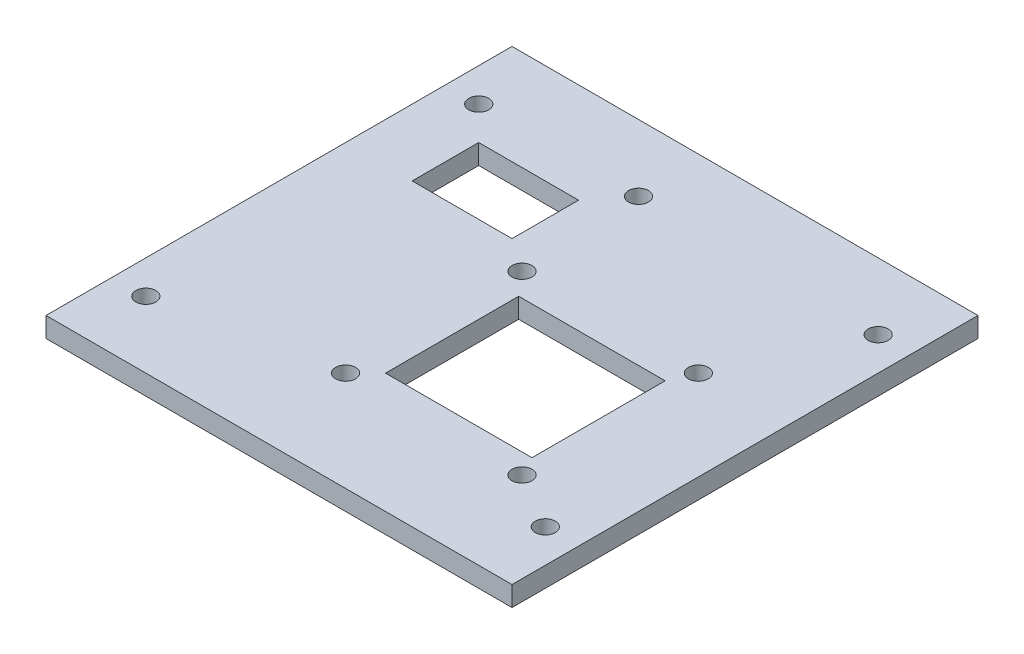
ISO-10303-21;
HEADER;
FILE_DESCRIPTION(('STEP AP214'),'2;1');
FILE_NAME('part.step','',(''),(''),'','','');
FILE_SCHEMA(('AUTOMOTIVE_DESIGN { 1 0 10303 214 1 1 1 1 }'));
ENDSEC;
DATA;
#1=APPLICATION_CONTEXT('core data for automotive mechanical design processes');
#2=APPLICATION_PROTOCOL_DEFINITION('international standard','automotive_design',2000,#1);
#3=PRODUCT_CONTEXT('',#1,'mechanical');
#4=PRODUCT('Part','Part','',(#3));
#5=PRODUCT_RELATED_PRODUCT_CATEGORY('part','',(#4));
#6=PRODUCT_DEFINITION_FORMATION('','',#4);
#7=PRODUCT_DEFINITION_CONTEXT('part definition',#1,'design');
#8=PRODUCT_DEFINITION('design','',#6,#7);
#9=PRODUCT_DEFINITION_SHAPE('','',#8);
#10=(LENGTH_UNIT() NAMED_UNIT(*) SI_UNIT(.MILLI.,.METRE.));
#11=(NAMED_UNIT(*) PLANE_ANGLE_UNIT() SI_UNIT($,.RADIAN.));
#12=(NAMED_UNIT(*) SI_UNIT($,.STERADIAN.) SOLID_ANGLE_UNIT());
#13=UNCERTAINTY_MEASURE_WITH_UNIT(LENGTH_MEASURE(1.E-05),#10,'distance_accuracy_value','');
#14=(GEOMETRIC_REPRESENTATION_CONTEXT(3) GLOBAL_UNCERTAINTY_ASSIGNED_CONTEXT((#13)) GLOBAL_UNIT_ASSIGNED_CONTEXT((#10,
#11,#12)) REPRESENTATION_CONTEXT('',''));
#15=CARTESIAN_POINT('',(0.,0.,0.));
#16=DIRECTION('',(0.,0.,1.));
#17=DIRECTION('',(1.,0.,0.));
#18=AXIS2_PLACEMENT_3D('',#15,#16,#17);
#19=CARTESIAN_POINT('',(-35.,3.,35.));
#20=DIRECTION('',(1.,0.,0.));
#21=DIRECTION('',(0.,0.,-1.));
#22=AXIS2_PLACEMENT_3D('',#19,#20,#21);
#23=PLANE('',#22);
#24=DIRECTION('',(0.,0.,1.));
#25=VECTOR('',#24,1.);
#26=CARTESIAN_POINT('',(-35.,0.,35.));
#27=LINE('',#26,#25);
#28=CARTESIAN_POINT('',(-35.,0.,-35.));
#29=VERTEX_POINT('',#28);
#30=CARTESIAN_POINT('',(-35.,0.,35.));
#31=VERTEX_POINT('',#30);
#32=EDGE_CURVE('E278',#29,#31,#27,.T.);
#33=ORIENTED_EDGE('',*,*,#32,.T.);
#34=DIRECTION('',(0.,-1.,0.));
#35=VECTOR('',#34,1.);
#36=CARTESIAN_POINT('',(-35.,3.,35.));
#37=LINE('',#36,#35);
#38=CARTESIAN_POINT('',(-35.,3.,35.));
#39=VERTEX_POINT('',#38);
#40=EDGE_CURVE('E11',#39,#31,#37,.T.);
#41=ORIENTED_EDGE('',*,*,#40,.F.);
#42=DIRECTION('',(0.,0.,1.));
#43=VECTOR('',#42,1.);
#44=CARTESIAN_POINT('',(-35.,3.,35.));
#45=LINE('',#44,#43);
#46=CARTESIAN_POINT('',(-35.,3.,-35.));
#47=VERTEX_POINT('',#46);
#48=EDGE_CURVE('E282',#47,#39,#45,.T.);
#49=ORIENTED_EDGE('',*,*,#48,.F.);
#50=DIRECTION('',(0.,-1.,0.));
#51=VECTOR('',#50,1.);
#52=CARTESIAN_POINT('',(-35.,3.,-35.));
#53=LINE('',#52,#51);
#54=EDGE_CURVE('E296',#47,#29,#53,.T.);
#55=ORIENTED_EDGE('',*,*,#54,.T.);
#56=EDGE_LOOP('',(#33,#41,#49,#55));
#57=FACE_BOUND('',#56,.T.);
#58=ADVANCED_FACE('F39',(#57),#23,.F.);
#59=CARTESIAN_POINT('',(35.,3.,35.));
#60=DIRECTION('',(0.,0.,-1.));
#61=DIRECTION('',(-1.,0.,0.));
#62=AXIS2_PLACEMENT_3D('',#59,#60,#61);
#63=PLANE('',#62);
#64=DIRECTION('',(1.,0.,0.));
#65=VECTOR('',#64,1.);
#66=CARTESIAN_POINT('',(35.,0.,35.));
#67=LINE('',#66,#65);
#68=CARTESIAN_POINT('',(35.,0.,35.));
#69=VERTEX_POINT('',#68);
#70=EDGE_CURVE('E300',#31,#69,#67,.T.);
#71=ORIENTED_EDGE('',*,*,#70,.T.);
#72=DIRECTION('',(0.,-1.,0.));
#73=VECTOR('',#72,1.);
#74=CARTESIAN_POINT('',(35.,3.,35.));
#75=LINE('',#74,#73);
#76=CARTESIAN_POINT('',(35.,3.,35.));
#77=VERTEX_POINT('',#76);
#78=EDGE_CURVE('E47',#77,#69,#75,.T.);
#79=ORIENTED_EDGE('',*,*,#78,.F.);
#80=DIRECTION('',(1.,0.,0.));
#81=VECTOR('',#80,1.);
#82=CARTESIAN_POINT('',(35.,3.,35.));
#83=LINE('',#82,#81);
#84=EDGE_CURVE('E286',#39,#77,#83,.T.);
#85=ORIENTED_EDGE('',*,*,#84,.F.);
#86=ORIENTED_EDGE('',*,*,#40,.T.);
#87=EDGE_LOOP('',(#71,#79,#85,#86));
#88=FACE_BOUND('',#87,.T.);
#89=ADVANCED_FACE('F335',(#88),#63,.F.);
#90=CARTESIAN_POINT('',(35.,3.,35.));
#91=DIRECTION('',(-1.,0.,0.));
#92=DIRECTION('',(0.,0.,1.));
#93=AXIS2_PLACEMENT_3D('',#90,#91,#92);
#94=PLANE('',#93);
#95=DIRECTION('',(0.,0.,-1.));
#96=VECTOR('',#95,1.);
#97=CARTESIAN_POINT('',(35.,0.,35.));
#98=LINE('',#97,#96);
#99=CARTESIAN_POINT('',(35.,0.,-35.));
#100=VERTEX_POINT('',#99);
#101=EDGE_CURVE('E303',#69,#100,#98,.T.);
#102=ORIENTED_EDGE('',*,*,#101,.T.);
#103=DIRECTION('',(0.,-1.,0.));
#104=VECTOR('',#103,1.);
#105=CARTESIAN_POINT('',(35.,3.,-35.));
#106=LINE('',#105,#104);
#107=CARTESIAN_POINT('',(35.,3.,-35.));
#108=VERTEX_POINT('',#107);
#109=EDGE_CURVE('E311',#108,#100,#106,.T.);
#110=ORIENTED_EDGE('',*,*,#109,.F.);
#111=DIRECTION('',(0.,0.,-1.));
#112=VECTOR('',#111,1.);
#113=CARTESIAN_POINT('',(35.,3.,35.));
#114=LINE('',#113,#112);
#115=EDGE_CURVE('E290',#77,#108,#114,.T.);
#116=ORIENTED_EDGE('',*,*,#115,.F.);
#117=ORIENTED_EDGE('',*,*,#78,.T.);
#118=EDGE_LOOP('',(#102,#110,#116,#117));
#119=FACE_BOUND('',#118,.T.);
#120=ADVANCED_FACE('F320',(#119),#94,.F.);
#121=CARTESIAN_POINT('',(35.,3.,-35.));
#122=DIRECTION('',(0.,0.,1.));
#123=DIRECTION('',(1.,0.,0.));
#124=AXIS2_PLACEMENT_3D('',#121,#122,#123);
#125=PLANE('',#124);
#126=DIRECTION('',(-1.,0.,0.));
#127=VECTOR('',#126,1.);
#128=CARTESIAN_POINT('',(35.,0.,-35.));
#129=LINE('',#128,#127);
#130=EDGE_CURVE('E287',#100,#29,#129,.T.);
#131=ORIENTED_EDGE('',*,*,#130,.T.);
#132=ORIENTED_EDGE('',*,*,#54,.F.);
#133=DIRECTION('',(-1.,0.,0.));
#134=VECTOR('',#133,1.);
#135=CARTESIAN_POINT('',(35.,3.,-35.));
#136=LINE('',#135,#134);
#137=EDGE_CURVE('E293',#108,#47,#136,.T.);
#138=ORIENTED_EDGE('',*,*,#137,.F.);
#139=ORIENTED_EDGE('',*,*,#109,.T.);
#140=EDGE_LOOP('',(#131,#132,#138,#139));
#141=FACE_BOUND('',#140,.T.);
#142=ADVANCED_FACE('F328',(#141),#125,.F.);
#143=CARTESIAN_POINT('',(0.,3.,0.));
#144=DIRECTION('',(0.,1.,0.));
#145=DIRECTION('',(0.,0.,1.));
#146=AXIS2_PLACEMENT_3D('',#143,#144,#145);
#147=PLANE('',#146);
#148=DIRECTION('',(0.,0.,-1.));
#149=VECTOR('',#148,1.);
#150=CARTESIAN_POINT('',(-10.,3.,-20.));
#151=LINE('',#150,#149);
#152=CARTESIAN_POINT('',(-10.,3.,-10.));
#153=VERTEX_POINT('',#152);
#154=CARTESIAN_POINT('',(-10.,3.,-20.));
#155=VERTEX_POINT('',#154);
#156=EDGE_CURVE('E54',#153,#155,#151,.T.);
#157=ORIENTED_EDGE('',*,*,#156,.F.);
#158=DIRECTION('',(1.,0.,0.));
#159=VECTOR('',#158,1.);
#160=CARTESIAN_POINT('',(-25.,3.,-10.));
#161=LINE('',#160,#159);
#162=CARTESIAN_POINT('',(-25.,3.,-10.));
#163=VERTEX_POINT('',#162);
#164=EDGE_CURVE('E189',#163,#153,#161,.T.);
#165=ORIENTED_EDGE('',*,*,#164,.F.);
#166=DIRECTION('',(0.,0.,1.));
#167=VECTOR('',#166,1.);
#168=CARTESIAN_POINT('',(-25.,3.,-20.));
#169=LINE('',#168,#167);
#170=CARTESIAN_POINT('',(-25.,3.,-20.));
#171=VERTEX_POINT('',#170);
#172=EDGE_CURVE('E209',#171,#163,#169,.T.);
#173=ORIENTED_EDGE('',*,*,#172,.F.);
#174=DIRECTION('',(-1.,0.,0.));
#175=VECTOR('',#174,1.);
#176=CARTESIAN_POINT('',(-25.,3.,-20.));
#177=LINE('',#176,#175);
#178=EDGE_CURVE('E204',#155,#171,#177,.T.);
#179=ORIENTED_EDGE('',*,*,#178,.F.);
#180=EDGE_LOOP('',(#157,#165,#173,#179));
#181=FACE_BOUND('',#180,.T.);
#182=DIRECTION('',(0.,0.,1.));
#183=VECTOR('',#182,1.);
#184=CARTESIAN_POINT('',(-1.99999999999999,3.,17.));
#185=LINE('',#184,#183);
#186=CARTESIAN_POINT('',(-1.99999999999999,3.,-2.99999999999999));
#187=VERTEX_POINT('',#186);
#188=CARTESIAN_POINT('',(-1.99999999999999,3.,17.));
#189=VERTEX_POINT('',#188);
#190=EDGE_CURVE('E62',#187,#189,#185,.T.);
#191=ORIENTED_EDGE('',*,*,#190,.F.);
#192=DIRECTION('',(-1.,0.,0.));
#193=VECTOR('',#192,1.);
#194=CARTESIAN_POINT('',(20.,3.,-3.));
#195=LINE('',#194,#193);
#196=CARTESIAN_POINT('',(20.,3.,-3.));
#197=VERTEX_POINT('',#196);
#198=EDGE_CURVE('E152',#197,#187,#195,.T.);
#199=ORIENTED_EDGE('',*,*,#198,.F.);
#200=DIRECTION('',(0.,0.,-1.));
#201=VECTOR('',#200,1.);
#202=CARTESIAN_POINT('',(20.,3.,17.));
#203=LINE('',#202,#201);
#204=CARTESIAN_POINT('',(20.,3.,17.));
#205=VERTEX_POINT('',#204);
#206=EDGE_CURVE('E156',#205,#197,#203,.T.);
#207=ORIENTED_EDGE('',*,*,#206,.F.);
#208=DIRECTION('',(1.,0.,0.));
#209=VECTOR('',#208,1.);
#210=CARTESIAN_POINT('',(20.,3.,17.));
#211=LINE('',#210,#209);
#212=EDGE_CURVE('E168',#189,#205,#211,.T.);
#213=ORIENTED_EDGE('',*,*,#212,.F.);
#214=EDGE_LOOP('',(#191,#199,#207,#213));
#215=FACE_BOUND('',#214,.T.);
#216=CARTESIAN_POINT('',(-5.,3.,20.));
#217=DIRECTION('',(0.,1.,0.));
#218=DIRECTION('',(0.,0.,1.));
#219=AXIS2_PLACEMENT_3D('',#216,#217,#218);
#220=CIRCLE('',#219,1.5);
#221=CARTESIAN_POINT('',(-5.,3.,21.5));
#222=VERTEX_POINT('',#221);
#223=EDGE_CURVE('E178',#222,#222,#220,.T.);
#224=ORIENTED_EDGE('',*,*,#223,.F.);
#225=EDGE_LOOP('',(#224));
#226=FACE_BOUND('',#225,.T.);
#227=CARTESIAN_POINT('',(21.5,3.,-6.49999999999999));
#228=DIRECTION('',(0.,1.,0.));
#229=DIRECTION('',(0.,0.,1.));
#230=AXIS2_PLACEMENT_3D('',#227,#228,#229);
#231=CIRCLE('',#230,1.49999999999998);
#232=CARTESIAN_POINT('',(21.5,3.,-5.00000000000001));
#233=VERTEX_POINT('',#232);
#234=EDGE_CURVE('E231',#233,#233,#231,.T.);
#235=ORIENTED_EDGE('',*,*,#234,.F.);
#236=EDGE_LOOP('',(#235));
#237=FACE_BOUND('',#236,.T.);
#238=CARTESIAN_POINT('',(-5.,3.,-6.5));
#239=DIRECTION('',(0.,1.,0.));
#240=DIRECTION('',(0.,0.,-1.));
#241=AXIS2_PLACEMENT_3D('',#238,#239,#240);
#242=CIRCLE('',#241,1.5);
#243=CARTESIAN_POINT('',(-5.,3.,-8.));
#244=VERTEX_POINT('',#243);
#245=EDGE_CURVE('E420',#244,#244,#242,.T.);
#246=ORIENTED_EDGE('',*,*,#245,.F.);
#247=EDGE_LOOP('',(#246));
#248=FACE_BOUND('',#247,.T.);
#249=CARTESIAN_POINT('',(-6.00000000000001,3.,-25.));
#250=DIRECTION('',(0.,1.,0.));
#251=DIRECTION('',(0.,0.,1.));
#252=AXIS2_PLACEMENT_3D('',#249,#250,#251);
#253=CIRCLE('',#252,1.5);
#254=CARTESIAN_POINT('',(-6.00000000000001,3.,-23.5));
#255=VERTEX_POINT('',#254);
#256=EDGE_CURVE('E159',#255,#255,#253,.T.);
#257=ORIENTED_EDGE('',*,*,#256,.F.);
#258=EDGE_LOOP('',(#257));
#259=FACE_BOUND('',#258,.T.);
#260=CARTESIAN_POINT('',(21.5,3.,20.));
#261=DIRECTION('',(0.,1.,0.));
#262=DIRECTION('',(0.,0.,-1.));
#263=AXIS2_PLACEMENT_3D('',#260,#261,#262);
#264=CIRCLE('',#263,1.5);
#265=CARTESIAN_POINT('',(21.5,3.,18.5));
#266=VERTEX_POINT('',#265);
#267=EDGE_CURVE('E230',#266,#266,#264,.T.);
#268=ORIENTED_EDGE('',*,*,#267,.F.);
#269=EDGE_LOOP('',(#268));
#270=FACE_BOUND('',#269,.T.);
#271=CARTESIAN_POINT('',(-30.,3.,25.));
#272=DIRECTION('',(0.,1.,0.));
#273=DIRECTION('',(0.,0.,-1.));
#274=AXIS2_PLACEMENT_3D('',#271,#272,#273);
#275=CIRCLE('',#274,1.5);
#276=CARTESIAN_POINT('',(-30.,3.,23.5));
#277=VERTEX_POINT('',#276);
#278=EDGE_CURVE('E246',#277,#277,#275,.T.);
#279=ORIENTED_EDGE('',*,*,#278,.F.);
#280=EDGE_LOOP('',(#279));
#281=FACE_BOUND('',#280,.T.);
#282=CARTESIAN_POINT('',(30.,3.,25.));
#283=DIRECTION('',(0.,1.,0.));
#284=DIRECTION('',(0.,0.,1.));
#285=AXIS2_PLACEMENT_3D('',#282,#283,#284);
#286=CIRCLE('',#285,1.50000000000001);
#287=CARTESIAN_POINT('',(30.,3.,26.5));
#288=VERTEX_POINT('',#287);
#289=EDGE_CURVE('E263',#288,#288,#286,.T.);
#290=ORIENTED_EDGE('',*,*,#289,.F.);
#291=EDGE_LOOP('',(#290));
#292=FACE_BOUND('',#291,.T.);
#293=CARTESIAN_POINT('',(30.,3.,-25.));
#294=DIRECTION('',(0.,1.,0.));
#295=DIRECTION('',(0.,0.,-1.));
#296=AXIS2_PLACEMENT_3D('',#293,#294,#295);
#297=CIRCLE('',#296,1.5);
#298=CARTESIAN_POINT('',(30.,3.,-26.5));
#299=VERTEX_POINT('',#298);
#300=EDGE_CURVE('E255',#299,#299,#297,.T.);
#301=ORIENTED_EDGE('',*,*,#300,.F.);
#302=EDGE_LOOP('',(#301));
#303=FACE_BOUND('',#302,.T.);
#304=CARTESIAN_POINT('',(-30.,3.,-25.));
#305=DIRECTION('',(0.,1.,0.));
#306=DIRECTION('',(0.,0.,1.));
#307=AXIS2_PLACEMENT_3D('',#304,#305,#306);
#308=CIRCLE('',#307,1.5);
#309=CARTESIAN_POINT('',(-30.,3.,-23.5));
#310=VERTEX_POINT('',#309);
#311=EDGE_CURVE('E254',#310,#310,#308,.T.);
#312=ORIENTED_EDGE('',*,*,#311,.F.);
#313=EDGE_LOOP('',(#312));
#314=FACE_BOUND('',#313,.T.);
#315=ORIENTED_EDGE('',*,*,#48,.T.);
#316=ORIENTED_EDGE('',*,*,#84,.T.);
#317=ORIENTED_EDGE('',*,*,#115,.T.);
#318=ORIENTED_EDGE('',*,*,#137,.T.);
#319=EDGE_LOOP('',(#315,#316,#317,#318));
#320=FACE_BOUND('',#319,.T.);
#321=ADVANCED_FACE('F334',(#181,#215,#226,#237,#248,#259,#270,#281,#292,#303,#314,#320),#147,.T.);
#322=CARTESIAN_POINT('',(0.,0.,0.));
#323=DIRECTION('',(0.,1.,0.));
#324=DIRECTION('',(0.,0.,1.));
#325=AXIS2_PLACEMENT_3D('',#322,#323,#324);
#326=PLANE('',#325);
#327=DIRECTION('',(1.,0.,0.));
#328=VECTOR('',#327,1.);
#329=CARTESIAN_POINT('',(-25.,0.,-10.));
#330=LINE('',#329,#328);
#331=CARTESIAN_POINT('',(-25.,0.,-10.));
#332=VERTEX_POINT('',#331);
#333=CARTESIAN_POINT('',(-10.,0.,-10.));
#334=VERTEX_POINT('',#333);
#335=EDGE_CURVE('E197',#332,#334,#330,.T.);
#336=ORIENTED_EDGE('',*,*,#335,.T.);
#337=DIRECTION('',(0.,0.,-1.));
#338=VECTOR('',#337,1.);
#339=CARTESIAN_POINT('',(-10.,0.,-20.));
#340=LINE('',#339,#338);
#341=CARTESIAN_POINT('',(-10.,0.,-20.));
#342=VERTEX_POINT('',#341);
#343=EDGE_CURVE('E184',#334,#342,#340,.T.);
#344=ORIENTED_EDGE('',*,*,#343,.T.);
#345=DIRECTION('',(-1.,0.,0.));
#346=VECTOR('',#345,1.);
#347=CARTESIAN_POINT('',(-25.,0.,-20.));
#348=LINE('',#347,#346);
#349=CARTESIAN_POINT('',(-25.,0.,-20.));
#350=VERTEX_POINT('',#349);
#351=EDGE_CURVE('E188',#342,#350,#348,.T.);
#352=ORIENTED_EDGE('',*,*,#351,.T.);
#353=DIRECTION('',(0.,0.,1.));
#354=VECTOR('',#353,1.);
#355=CARTESIAN_POINT('',(-25.,0.,-20.));
#356=LINE('',#355,#354);
#357=EDGE_CURVE('E193',#350,#332,#356,.T.);
#358=ORIENTED_EDGE('',*,*,#357,.T.);
#359=EDGE_LOOP('',(#336,#344,#352,#358));
#360=FACE_BOUND('',#359,.T.);
#361=DIRECTION('',(-1.,0.,0.));
#362=VECTOR('',#361,1.);
#363=CARTESIAN_POINT('',(20.,0.,-3.));
#364=LINE('',#363,#362);
#365=CARTESIAN_POINT('',(20.,0.,-3.));
#366=VERTEX_POINT('',#365);
#367=CARTESIAN_POINT('',(-1.99999999999999,0.,-2.99999999999999));
#368=VERTEX_POINT('',#367);
#369=EDGE_CURVE('E137',#366,#368,#364,.T.);
#370=ORIENTED_EDGE('',*,*,#369,.T.);
#371=DIRECTION('',(0.,0.,1.));
#372=VECTOR('',#371,1.);
#373=CARTESIAN_POINT('',(-1.99999999999999,0.,17.));
#374=LINE('',#373,#372);
#375=CARTESIAN_POINT('',(-1.99999999999999,0.,17.));
#376=VERTEX_POINT('',#375);
#377=EDGE_CURVE('E130',#368,#376,#374,.T.);
#378=ORIENTED_EDGE('',*,*,#377,.T.);
#379=DIRECTION('',(1.,0.,0.));
#380=VECTOR('',#379,1.);
#381=CARTESIAN_POINT('',(20.,0.,17.));
#382=LINE('',#381,#380);
#383=CARTESIAN_POINT('',(20.,0.,17.));
#384=VERTEX_POINT('',#383);
#385=EDGE_CURVE('E141',#376,#384,#382,.T.);
#386=ORIENTED_EDGE('',*,*,#385,.T.);
#387=DIRECTION('',(0.,0.,-1.));
#388=VECTOR('',#387,1.);
#389=CARTESIAN_POINT('',(20.,0.,17.));
#390=LINE('',#389,#388);
#391=EDGE_CURVE('E146',#384,#366,#390,.T.);
#392=ORIENTED_EDGE('',*,*,#391,.T.);
#393=EDGE_LOOP('',(#370,#378,#386,#392));
#394=FACE_BOUND('',#393,.T.);
#395=CARTESIAN_POINT('',(-5.,0.,20.));
#396=DIRECTION('',(0.,1.,0.));
#397=DIRECTION('',(0.,0.,1.));
#398=AXIS2_PLACEMENT_3D('',#395,#396,#397);
#399=CIRCLE('',#398,1.5);
#400=CARTESIAN_POINT('',(-5.,0.,21.5));
#401=VERTEX_POINT('',#400);
#402=EDGE_CURVE('E235',#401,#401,#399,.T.);
#403=ORIENTED_EDGE('',*,*,#402,.T.);
#404=EDGE_LOOP('',(#403));
#405=FACE_BOUND('',#404,.T.);
#406=CARTESIAN_POINT('',(21.5,0.,-6.49999999999999));
#407=DIRECTION('',(0.,1.,0.));
#408=DIRECTION('',(0.,0.,1.));
#409=AXIS2_PLACEMENT_3D('',#406,#407,#408);
#410=CIRCLE('',#409,1.49999999999998);
#411=CARTESIAN_POINT('',(21.5,0.,-5.00000000000001));
#412=VERTEX_POINT('',#411);
#413=EDGE_CURVE('E226',#412,#412,#410,.T.);
#414=ORIENTED_EDGE('',*,*,#413,.T.);
#415=EDGE_LOOP('',(#414));
#416=FACE_BOUND('',#415,.T.);
#417=CARTESIAN_POINT('',(-5.,0.,-6.5));
#418=DIRECTION('',(0.,1.,0.));
#419=DIRECTION('',(0.,0.,-1.));
#420=AXIS2_PLACEMENT_3D('',#417,#418,#419);
#421=CIRCLE('',#420,1.5);
#422=CARTESIAN_POINT('',(-5.,0.,-8.));
#423=VERTEX_POINT('',#422);
#424=EDGE_CURVE('E205',#423,#423,#421,.T.);
#425=ORIENTED_EDGE('',*,*,#424,.T.);
#426=EDGE_LOOP('',(#425));
#427=FACE_BOUND('',#426,.T.);
#428=CARTESIAN_POINT('',(-6.00000000000001,0.,-25.));
#429=DIRECTION('',(0.,1.,0.));
#430=DIRECTION('',(0.,0.,1.));
#431=AXIS2_PLACEMENT_3D('',#428,#429,#430);
#432=CIRCLE('',#431,1.5);
#433=CARTESIAN_POINT('',(-6.00000000000001,0.,-23.5));
#434=VERTEX_POINT('',#433);
#435=EDGE_CURVE('E423',#434,#434,#432,.T.);
#436=ORIENTED_EDGE('',*,*,#435,.T.);
#437=EDGE_LOOP('',(#436));
#438=FACE_BOUND('',#437,.T.);
#439=CARTESIAN_POINT('',(21.5,0.,20.));
#440=DIRECTION('',(0.,1.,0.));
#441=DIRECTION('',(0.,0.,-1.));
#442=AXIS2_PLACEMENT_3D('',#439,#440,#441);
#443=CIRCLE('',#442,1.5);
#444=CARTESIAN_POINT('',(21.5,0.,18.5));
#445=VERTEX_POINT('',#444);
#446=EDGE_CURVE('E242',#445,#445,#443,.T.);
#447=ORIENTED_EDGE('',*,*,#446,.T.);
#448=EDGE_LOOP('',(#447));
#449=FACE_BOUND('',#448,.T.);
#450=CARTESIAN_POINT('',(-30.,0.,25.));
#451=DIRECTION('',(0.,1.,0.));
#452=DIRECTION('',(0.,0.,-1.));
#453=AXIS2_PLACEMENT_3D('',#450,#451,#452);
#454=CIRCLE('',#453,1.5);
#455=CARTESIAN_POINT('',(-30.,0.,23.5));
#456=VERTEX_POINT('',#455);
#457=EDGE_CURVE('E267',#456,#456,#454,.T.);
#458=ORIENTED_EDGE('',*,*,#457,.T.);
#459=EDGE_LOOP('',(#458));
#460=FACE_BOUND('',#459,.T.);
#461=CARTESIAN_POINT('',(30.,0.,25.));
#462=DIRECTION('',(0.,1.,0.));
#463=DIRECTION('',(0.,0.,1.));
#464=AXIS2_PLACEMENT_3D('',#461,#462,#463);
#465=CIRCLE('',#464,1.50000000000001);
#466=CARTESIAN_POINT('',(30.,0.,26.5));
#467=VERTEX_POINT('',#466);
#468=EDGE_CURVE('E259',#467,#467,#465,.T.);
#469=ORIENTED_EDGE('',*,*,#468,.T.);
#470=EDGE_LOOP('',(#469));
#471=FACE_BOUND('',#470,.T.);
#472=CARTESIAN_POINT('',(30.,0.,-25.));
#473=DIRECTION('',(0.,1.,0.));
#474=DIRECTION('',(0.,0.,-1.));
#475=AXIS2_PLACEMENT_3D('',#472,#473,#474);
#476=CIRCLE('',#475,1.5);
#477=CARTESIAN_POINT('',(30.,0.,-26.5));
#478=VERTEX_POINT('',#477);
#479=EDGE_CURVE('E250',#478,#478,#476,.T.);
#480=ORIENTED_EDGE('',*,*,#479,.T.);
#481=EDGE_LOOP('',(#480));
#482=FACE_BOUND('',#481,.T.);
#483=CARTESIAN_POINT('',(-30.,0.,-25.));
#484=DIRECTION('',(0.,1.,0.));
#485=DIRECTION('',(0.,0.,1.));
#486=AXIS2_PLACEMENT_3D('',#483,#484,#485);
#487=CIRCLE('',#486,1.5);
#488=CARTESIAN_POINT('',(-30.,0.,-23.5));
#489=VERTEX_POINT('',#488);
#490=EDGE_CURVE('E274',#489,#489,#487,.T.);
#491=ORIENTED_EDGE('',*,*,#490,.T.);
#492=EDGE_LOOP('',(#491));
#493=FACE_BOUND('',#492,.T.);
#494=ORIENTED_EDGE('',*,*,#32,.F.);
#495=ORIENTED_EDGE('',*,*,#130,.F.);
#496=ORIENTED_EDGE('',*,*,#101,.F.);
#497=ORIENTED_EDGE('',*,*,#70,.F.);
#498=EDGE_LOOP('',(#494,#495,#496,#497));
#499=FACE_BOUND('',#498,.T.);
#500=ADVANCED_FACE('F148',(#360,#394,#405,#416,#427,#438,#449,#460,#471,#482,#493,#499),#326,.F.);
#501=CARTESIAN_POINT('',(-30.,0.,-25.));
#502=DIRECTION('',(0.,1.,0.));
#503=DIRECTION('',(0.,0.,1.));
#504=AXIS2_PLACEMENT_3D('',#501,#502,#503);
#505=CYLINDRICAL_SURFACE('',#504,1.5);
#506=ORIENTED_EDGE('',*,*,#490,.F.);
#507=EDGE_LOOP('',(#506));
#508=FACE_BOUND('',#507,.T.);
#509=ORIENTED_EDGE('',*,*,#311,.T.);
#510=EDGE_LOOP('',(#509));
#511=FACE_BOUND('',#510,.T.);
#512=ADVANCED_FACE('F347',(#508,#511),#505,.F.);
#513=CARTESIAN_POINT('',(30.,0.,-25.));
#514=DIRECTION('',(0.,1.,0.));
#515=DIRECTION('',(0.,0.,1.));
#516=AXIS2_PLACEMENT_3D('',#513,#514,#515);
#517=CYLINDRICAL_SURFACE('',#516,1.5);
#518=ORIENTED_EDGE('',*,*,#479,.F.);
#519=EDGE_LOOP('',(#518));
#520=FACE_BOUND('',#519,.T.);
#521=ORIENTED_EDGE('',*,*,#300,.T.);
#522=EDGE_LOOP('',(#521));
#523=FACE_BOUND('',#522,.T.);
#524=ADVANCED_FACE('F354',(#520,#523),#517,.F.);
#525=CARTESIAN_POINT('',(30.,0.,25.));
#526=DIRECTION('',(0.,1.,0.));
#527=DIRECTION('',(0.,0.,1.));
#528=AXIS2_PLACEMENT_3D('',#525,#526,#527);
#529=CYLINDRICAL_SURFACE('',#528,1.50000000000001);
#530=ORIENTED_EDGE('',*,*,#468,.F.);
#531=EDGE_LOOP('',(#530));
#532=FACE_BOUND('',#531,.T.);
#533=ORIENTED_EDGE('',*,*,#289,.T.);
#534=EDGE_LOOP('',(#533));
#535=FACE_BOUND('',#534,.T.);
#536=ADVANCED_FACE('F360',(#532,#535),#529,.F.);
#537=CARTESIAN_POINT('',(-30.,0.,25.));
#538=DIRECTION('',(0.,1.,0.));
#539=DIRECTION('',(0.,0.,1.));
#540=AXIS2_PLACEMENT_3D('',#537,#538,#539);
#541=CYLINDRICAL_SURFACE('',#540,1.5);
#542=ORIENTED_EDGE('',*,*,#457,.F.);
#543=EDGE_LOOP('',(#542));
#544=FACE_BOUND('',#543,.T.);
#545=ORIENTED_EDGE('',*,*,#278,.T.);
#546=EDGE_LOOP('',(#545));
#547=FACE_BOUND('',#546,.T.);
#548=ADVANCED_FACE('F356',(#544,#547),#541,.F.);
#549=CARTESIAN_POINT('',(21.5,0.,20.));
#550=DIRECTION('',(0.,1.,0.));
#551=DIRECTION('',(0.,0.,1.));
#552=AXIS2_PLACEMENT_3D('',#549,#550,#551);
#553=CYLINDRICAL_SURFACE('',#552,1.5);
#554=ORIENTED_EDGE('',*,*,#446,.F.);
#555=EDGE_LOOP('',(#554));
#556=FACE_BOUND('',#555,.T.);
#557=ORIENTED_EDGE('',*,*,#267,.T.);
#558=EDGE_LOOP('',(#557));
#559=FACE_BOUND('',#558,.T.);
#560=ADVANCED_FACE('F359',(#556,#559),#553,.F.);
#561=CARTESIAN_POINT('',(-6.00000000000001,0.,-25.));
#562=DIRECTION('',(0.,1.,0.));
#563=DIRECTION('',(0.,0.,1.));
#564=AXIS2_PLACEMENT_3D('',#561,#562,#563);
#565=CYLINDRICAL_SURFACE('',#564,1.5);
#566=ORIENTED_EDGE('',*,*,#435,.F.);
#567=EDGE_LOOP('',(#566));
#568=FACE_BOUND('',#567,.T.);
#569=ORIENTED_EDGE('',*,*,#256,.T.);
#570=EDGE_LOOP('',(#569));
#571=FACE_BOUND('',#570,.T.);
#572=ADVANCED_FACE('F370',(#568,#571),#565,.F.);
#573=CARTESIAN_POINT('',(-5.,0.,-6.5));
#574=DIRECTION('',(0.,1.,0.));
#575=DIRECTION('',(0.,0.,1.));
#576=AXIS2_PLACEMENT_3D('',#573,#574,#575);
#577=CYLINDRICAL_SURFACE('',#576,1.5);
#578=ORIENTED_EDGE('',*,*,#424,.F.);
#579=EDGE_LOOP('',(#578));
#580=FACE_BOUND('',#579,.T.);
#581=ORIENTED_EDGE('',*,*,#245,.T.);
#582=EDGE_LOOP('',(#581));
#583=FACE_BOUND('',#582,.T.);
#584=ADVANCED_FACE('F379',(#580,#583),#577,.F.);
#585=CARTESIAN_POINT('',(21.5,0.,-6.49999999999999));
#586=DIRECTION('',(0.,1.,0.));
#587=DIRECTION('',(0.,0.,1.));
#588=AXIS2_PLACEMENT_3D('',#585,#586,#587);
#589=CYLINDRICAL_SURFACE('',#588,1.49999999999998);
#590=ORIENTED_EDGE('',*,*,#413,.F.);
#591=EDGE_LOOP('',(#590));
#592=FACE_BOUND('',#591,.T.);
#593=ORIENTED_EDGE('',*,*,#234,.T.);
#594=EDGE_LOOP('',(#593));
#595=FACE_BOUND('',#594,.T.);
#596=ADVANCED_FACE('F375',(#592,#595),#589,.F.);
#597=CARTESIAN_POINT('',(-5.,0.,20.));
#598=DIRECTION('',(0.,1.,0.));
#599=DIRECTION('',(0.,0.,1.));
#600=AXIS2_PLACEMENT_3D('',#597,#598,#599);
#601=CYLINDRICAL_SURFACE('',#600,1.5);
#602=ORIENTED_EDGE('',*,*,#402,.F.);
#603=EDGE_LOOP('',(#602));
#604=FACE_BOUND('',#603,.T.);
#605=ORIENTED_EDGE('',*,*,#223,.T.);
#606=EDGE_LOOP('',(#605));
#607=FACE_BOUND('',#606,.T.);
#608=ADVANCED_FACE('F372',(#604,#607),#601,.F.);
#609=CARTESIAN_POINT('',(-1.99999999999999,0.,17.));
#610=DIRECTION('',(-1.,0.,0.));
#611=DIRECTION('',(0.,0.,1.));
#612=AXIS2_PLACEMENT_3D('',#609,#610,#611);
#613=PLANE('',#612);
#614=ORIENTED_EDGE('',*,*,#190,.T.);
#615=DIRECTION('',(0.,1.,0.));
#616=VECTOR('',#615,1.);
#617=CARTESIAN_POINT('',(-1.99999999999999,0.,17.));
#618=LINE('',#617,#616);
#619=EDGE_CURVE('E126',#376,#189,#618,.T.);
#620=ORIENTED_EDGE('',*,*,#619,.F.);
#621=ORIENTED_EDGE('',*,*,#377,.F.);
#622=DIRECTION('',(0.,1.,0.));
#623=VECTOR('',#622,1.);
#624=CARTESIAN_POINT('',(-1.99999999999999,0.,-2.99999999999999));
#625=LINE('',#624,#623);
#626=EDGE_CURVE('E175',#368,#187,#625,.T.);
#627=ORIENTED_EDGE('',*,*,#626,.T.);
#628=EDGE_LOOP('',(#614,#620,#621,#627));
#629=FACE_BOUND('',#628,.T.);
#630=ADVANCED_FACE('F128',(#629),#613,.F.);
#631=CARTESIAN_POINT('',(20.,0.,-3.));
#632=DIRECTION('',(0.,0.,-1.));
#633=DIRECTION('',(-1.,0.,0.));
#634=AXIS2_PLACEMENT_3D('',#631,#632,#633);
#635=PLANE('',#634);
#636=ORIENTED_EDGE('',*,*,#198,.T.);
#637=ORIENTED_EDGE('',*,*,#626,.F.);
#638=ORIENTED_EDGE('',*,*,#369,.F.);
#639=DIRECTION('',(0.,1.,0.));
#640=VECTOR('',#639,1.);
#641=CARTESIAN_POINT('',(20.,0.,-3.));
#642=LINE('',#641,#640);
#643=EDGE_CURVE('E179',#366,#197,#642,.T.);
#644=ORIENTED_EDGE('',*,*,#643,.T.);
#645=EDGE_LOOP('',(#636,#637,#638,#644));
#646=FACE_BOUND('',#645,.T.);
#647=ADVANCED_FACE('F398',(#646),#635,.F.);
#648=CARTESIAN_POINT('',(20.,0.,17.));
#649=DIRECTION('',(1.,0.,0.));
#650=DIRECTION('',(0.,0.,-1.));
#651=AXIS2_PLACEMENT_3D('',#648,#649,#650);
#652=PLANE('',#651);
#653=ORIENTED_EDGE('',*,*,#206,.T.);
#654=ORIENTED_EDGE('',*,*,#643,.F.);
#655=ORIENTED_EDGE('',*,*,#391,.F.);
#656=DIRECTION('',(0.,1.,0.));
#657=VECTOR('',#656,1.);
#658=CARTESIAN_POINT('',(20.,0.,17.));
#659=LINE('',#658,#657);
#660=EDGE_CURVE('E136',#384,#205,#659,.T.);
#661=ORIENTED_EDGE('',*,*,#660,.T.);
#662=EDGE_LOOP('',(#653,#654,#655,#661));
#663=FACE_BOUND('',#662,.T.);
#664=ADVANCED_FACE('F401',(#663),#652,.F.);
#665=CARTESIAN_POINT('',(20.,0.,17.));
#666=DIRECTION('',(0.,0.,1.));
#667=DIRECTION('',(1.,0.,0.));
#668=AXIS2_PLACEMENT_3D('',#665,#666,#667);
#669=PLANE('',#668);
#670=ORIENTED_EDGE('',*,*,#212,.T.);
#671=ORIENTED_EDGE('',*,*,#660,.F.);
#672=ORIENTED_EDGE('',*,*,#385,.F.);
#673=ORIENTED_EDGE('',*,*,#619,.T.);
#674=EDGE_LOOP('',(#670,#671,#672,#673));
#675=FACE_BOUND('',#674,.T.);
#676=ADVANCED_FACE('F142',(#675),#669,.F.);
#677=CARTESIAN_POINT('',(-10.,0.,-20.));
#678=DIRECTION('',(1.,0.,0.));
#679=DIRECTION('',(0.,0.,-1.));
#680=AXIS2_PLACEMENT_3D('',#677,#678,#679);
#681=PLANE('',#680);
#682=ORIENTED_EDGE('',*,*,#156,.T.);
#683=DIRECTION('',(0.,1.,0.));
#684=VECTOR('',#683,1.);
#685=CARTESIAN_POINT('',(-10.,0.,-20.));
#686=LINE('',#685,#684);
#687=EDGE_CURVE('E201',#342,#155,#686,.T.);
#688=ORIENTED_EDGE('',*,*,#687,.F.);
#689=ORIENTED_EDGE('',*,*,#343,.F.);
#690=DIRECTION('',(0.,1.,0.));
#691=VECTOR('',#690,1.);
#692=CARTESIAN_POINT('',(-10.,0.,-10.));
#693=LINE('',#692,#691);
#694=EDGE_CURVE('E169',#334,#153,#693,.T.);
#695=ORIENTED_EDGE('',*,*,#694,.T.);
#696=EDGE_LOOP('',(#682,#688,#689,#695));
#697=FACE_BOUND('',#696,.T.);
#698=ADVANCED_FACE('F381',(#697),#681,.F.);
#699=CARTESIAN_POINT('',(-25.,0.,-10.));
#700=DIRECTION('',(0.,0.,1.));
#701=DIRECTION('',(1.,0.,0.));
#702=AXIS2_PLACEMENT_3D('',#699,#700,#701);
#703=PLANE('',#702);
#704=ORIENTED_EDGE('',*,*,#164,.T.);
#705=ORIENTED_EDGE('',*,*,#694,.F.);
#706=ORIENTED_EDGE('',*,*,#335,.F.);
#707=DIRECTION('',(0.,1.,0.));
#708=VECTOR('',#707,1.);
#709=CARTESIAN_POINT('',(-25.,0.,-10.));
#710=LINE('',#709,#708);
#711=EDGE_CURVE('E218',#332,#163,#710,.T.);
#712=ORIENTED_EDGE('',*,*,#711,.T.);
#713=EDGE_LOOP('',(#704,#705,#706,#712));
#714=FACE_BOUND('',#713,.T.);
#715=ADVANCED_FACE('F384',(#714),#703,.F.);
#716=CARTESIAN_POINT('',(-25.,0.,-20.));
#717=DIRECTION('',(-1.,0.,0.));
#718=DIRECTION('',(0.,0.,1.));
#719=AXIS2_PLACEMENT_3D('',#716,#717,#718);
#720=PLANE('',#719);
#721=ORIENTED_EDGE('',*,*,#172,.T.);
#722=ORIENTED_EDGE('',*,*,#711,.F.);
#723=ORIENTED_EDGE('',*,*,#357,.F.);
#724=DIRECTION('',(0.,1.,0.));
#725=VECTOR('',#724,1.);
#726=CARTESIAN_POINT('',(-25.,0.,-20.));
#727=LINE('',#726,#725);
#728=EDGE_CURVE('E221',#350,#171,#727,.T.);
#729=ORIENTED_EDGE('',*,*,#728,.T.);
#730=EDGE_LOOP('',(#721,#722,#723,#729));
#731=FACE_BOUND('',#730,.T.);
#732=ADVANCED_FACE('F388',(#731),#720,.F.);
#733=CARTESIAN_POINT('',(-25.,0.,-20.));
#734=DIRECTION('',(0.,0.,-1.));
#735=DIRECTION('',(-1.,0.,0.));
#736=AXIS2_PLACEMENT_3D('',#733,#734,#735);
#737=PLANE('',#736);
#738=ORIENTED_EDGE('',*,*,#178,.T.);
#739=ORIENTED_EDGE('',*,*,#728,.F.);
#740=ORIENTED_EDGE('',*,*,#351,.F.);
#741=ORIENTED_EDGE('',*,*,#687,.T.);
#742=EDGE_LOOP('',(#738,#739,#740,#741));
#743=FACE_BOUND('',#742,.T.);
#744=ADVANCED_FACE('F385',(#743),#737,.F.);
#745=CLOSED_SHELL('',(#58,#89,#120,#142,#321,#500,#512,#524,#536,#548,#560,#572,#584,#596,#608,
#630,#647,#664,#676,#698,#715,#732,#744));
#746=MANIFOLD_SOLID_BREP('B2',#745);
#747=ADVANCED_BREP_SHAPE_REPRESENTATION('',(#18,#746),#14);
#748=SHAPE_DEFINITION_REPRESENTATION(#9,#747);
ENDSEC;
END-ISO-10303-21;
